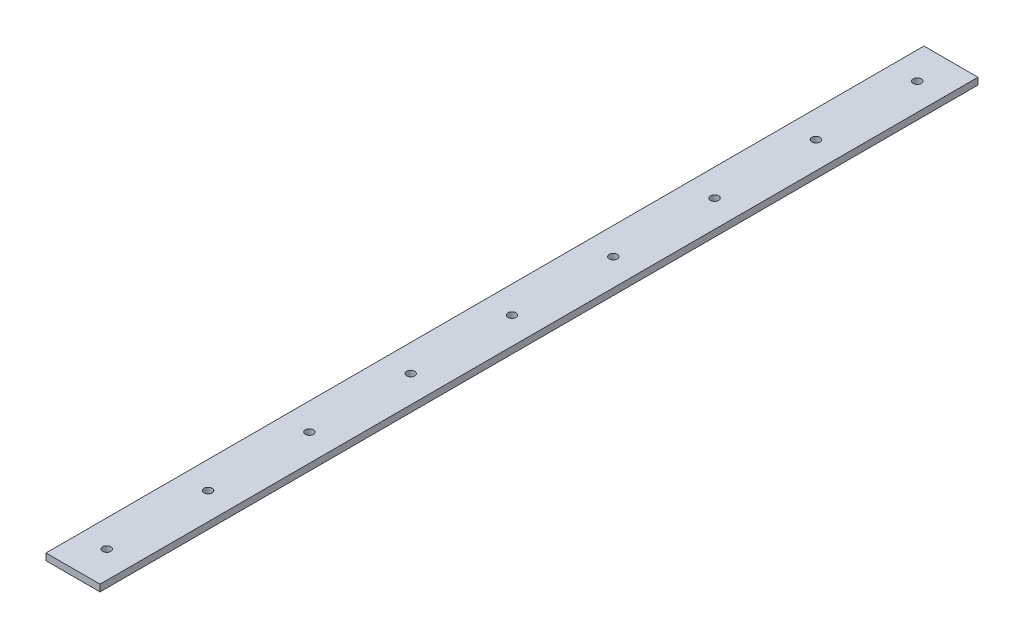
ISO-10303-21;
HEADER;
FILE_DESCRIPTION(('STEP AP214'),'2;1');
FILE_NAME('part.step','',(''),(''),'','','');
FILE_SCHEMA(('AUTOMOTIVE_DESIGN { 1 0 10303 214 1 1 1 1 }'));
ENDSEC;
DATA;
#1=APPLICATION_CONTEXT('core data for automotive mechanical design processes');
#2=APPLICATION_PROTOCOL_DEFINITION('international standard','automotive_design',2000,#1);
#3=PRODUCT_CONTEXT('',#1,'mechanical');
#4=PRODUCT('Part','Part','',(#3));
#5=PRODUCT_RELATED_PRODUCT_CATEGORY('part','',(#4));
#6=PRODUCT_DEFINITION_FORMATION('','',#4);
#7=PRODUCT_DEFINITION_CONTEXT('part definition',#1,'design');
#8=PRODUCT_DEFINITION('design','',#6,#7);
#9=PRODUCT_DEFINITION_SHAPE('','',#8);
#10=(LENGTH_UNIT() NAMED_UNIT(*) SI_UNIT(.MILLI.,.METRE.));
#11=(NAMED_UNIT(*) PLANE_ANGLE_UNIT() SI_UNIT($,.RADIAN.));
#12=(NAMED_UNIT(*) SI_UNIT($,.STERADIAN.) SOLID_ANGLE_UNIT());
#13=UNCERTAINTY_MEASURE_WITH_UNIT(LENGTH_MEASURE(1.E-05),#10,'distance_accuracy_value','');
#14=(GEOMETRIC_REPRESENTATION_CONTEXT(3) GLOBAL_UNCERTAINTY_ASSIGNED_CONTEXT((#13)) GLOBAL_UNIT_ASSIGNED_CONTEXT((#10,
#11,#12)) REPRESENTATION_CONTEXT('',''));
#15=CARTESIAN_POINT('',(0.,0.,0.));
#16=DIRECTION('',(0.,0.,1.));
#17=DIRECTION('',(1.,0.,0.));
#18=AXIS2_PLACEMENT_3D('',#15,#16,#17);
#19=CARTESIAN_POINT('',(20.,5.,325.));
#20=DIRECTION('',(-1.,0.,0.));
#21=DIRECTION('',(0.,0.,1.));
#22=AXIS2_PLACEMENT_3D('',#19,#20,#21);
#23=PLANE('',#22);
#24=DIRECTION('',(0.,0.,-1.));
#25=VECTOR('',#24,1.);
#26=CARTESIAN_POINT('',(20.,0.,325.));
#27=LINE('',#26,#25);
#28=CARTESIAN_POINT('',(20.,0.,325.));
#29=VERTEX_POINT('',#28);
#30=CARTESIAN_POINT('',(20.,0.,-325.));
#31=VERTEX_POINT('',#30);
#32=EDGE_CURVE('E184',#29,#31,#27,.T.);
#33=ORIENTED_EDGE('',*,*,#32,.T.);
#34=DIRECTION('',(0.,-1.,0.));
#35=VECTOR('',#34,1.);
#36=CARTESIAN_POINT('',(20.,5.,-325.));
#37=LINE('',#36,#35);
#38=CARTESIAN_POINT('',(20.,5.,-325.));
#39=VERTEX_POINT('',#38);
#40=EDGE_CURVE('E12',#39,#31,#37,.T.);
#41=ORIENTED_EDGE('',*,*,#40,.F.);
#42=DIRECTION('',(0.,0.,-1.));
#43=VECTOR('',#42,1.);
#44=CARTESIAN_POINT('',(20.,5.,325.));
#45=LINE('',#44,#43);
#46=CARTESIAN_POINT('',(20.,5.,325.));
#47=VERTEX_POINT('',#46);
#48=EDGE_CURVE('E88',#47,#39,#45,.T.);
#49=ORIENTED_EDGE('',*,*,#48,.F.);
#50=DIRECTION('',(0.,-1.,0.));
#51=VECTOR('',#50,1.);
#52=CARTESIAN_POINT('',(20.,5.,325.));
#53=LINE('',#52,#51);
#54=EDGE_CURVE('E97',#47,#29,#53,.T.);
#55=ORIENTED_EDGE('',*,*,#54,.T.);
#56=EDGE_LOOP('',(#33,#41,#49,#55));
#57=FACE_BOUND('',#56,.T.);
#58=ADVANCED_FACE('F35',(#57),#23,.F.);
#59=CARTESIAN_POINT('',(-20.,5.,-325.));
#60=DIRECTION('',(0.,0.,1.));
#61=DIRECTION('',(1.,0.,0.));
#62=AXIS2_PLACEMENT_3D('',#59,#60,#61);
#63=PLANE('',#62);
#64=DIRECTION('',(-1.,0.,0.));
#65=VECTOR('',#64,1.);
#66=CARTESIAN_POINT('',(-20.,0.,-325.));
#67=LINE('',#66,#65);
#68=CARTESIAN_POINT('',(-20.,0.,-325.));
#69=VERTEX_POINT('',#68);
#70=EDGE_CURVE('E92',#31,#69,#67,.T.);
#71=ORIENTED_EDGE('',*,*,#70,.T.);
#72=DIRECTION('',(0.,-1.,0.));
#73=VECTOR('',#72,1.);
#74=CARTESIAN_POINT('',(-20.,5.,-325.));
#75=LINE('',#74,#73);
#76=CARTESIAN_POINT('',(-20.,5.,-325.));
#77=VERTEX_POINT('',#76);
#78=EDGE_CURVE('E44',#77,#69,#75,.T.);
#79=ORIENTED_EDGE('',*,*,#78,.F.);
#80=DIRECTION('',(-1.,0.,0.));
#81=VECTOR('',#80,1.);
#82=CARTESIAN_POINT('',(-20.,5.,-325.));
#83=LINE('',#82,#81);
#84=EDGE_CURVE('E83',#39,#77,#83,.T.);
#85=ORIENTED_EDGE('',*,*,#84,.F.);
#86=ORIENTED_EDGE('',*,*,#40,.T.);
#87=EDGE_LOOP('',(#71,#79,#85,#86));
#88=FACE_BOUND('',#87,.T.);
#89=ADVANCED_FACE('F91',(#88),#63,.F.);
#90=CARTESIAN_POINT('',(-20.,5.,325.));
#91=DIRECTION('',(1.,0.,0.));
#92=DIRECTION('',(0.,0.,-1.));
#93=AXIS2_PLACEMENT_3D('',#90,#91,#92);
#94=PLANE('',#93);
#95=DIRECTION('',(0.,0.,1.));
#96=VECTOR('',#95,1.);
#97=CARTESIAN_POINT('',(-20.,0.,325.));
#98=LINE('',#97,#96);
#99=CARTESIAN_POINT('',(-20.,0.,325.));
#100=VERTEX_POINT('',#99);
#101=EDGE_CURVE('E70',#69,#100,#98,.T.);
#102=ORIENTED_EDGE('',*,*,#101,.T.);
#103=DIRECTION('',(0.,-1.,0.));
#104=VECTOR('',#103,1.);
#105=CARTESIAN_POINT('',(-20.,5.,325.));
#106=LINE('',#105,#104);
#107=CARTESIAN_POINT('',(-20.,5.,325.));
#108=VERTEX_POINT('',#107);
#109=EDGE_CURVE('E93',#108,#100,#106,.T.);
#110=ORIENTED_EDGE('',*,*,#109,.F.);
#111=DIRECTION('',(0.,0.,1.));
#112=VECTOR('',#111,1.);
#113=CARTESIAN_POINT('',(-20.,5.,325.));
#114=LINE('',#113,#112);
#115=EDGE_CURVE('E86',#77,#108,#114,.T.);
#116=ORIENTED_EDGE('',*,*,#115,.F.);
#117=ORIENTED_EDGE('',*,*,#78,.T.);
#118=EDGE_LOOP('',(#102,#110,#116,#117));
#119=FACE_BOUND('',#118,.T.);
#120=ADVANCED_FACE('F95',(#119),#94,.F.);
#121=CARTESIAN_POINT('',(-20.,5.,325.));
#122=DIRECTION('',(0.,0.,-1.));
#123=DIRECTION('',(-1.,0.,0.));
#124=AXIS2_PLACEMENT_3D('',#121,#122,#123);
#125=PLANE('',#124);
#126=DIRECTION('',(1.,0.,0.));
#127=VECTOR('',#126,1.);
#128=CARTESIAN_POINT('',(-20.,0.,325.));
#129=LINE('',#128,#127);
#130=EDGE_CURVE('E76',#100,#29,#129,.T.);
#131=ORIENTED_EDGE('',*,*,#130,.T.);
#132=ORIENTED_EDGE('',*,*,#54,.F.);
#133=DIRECTION('',(1.,0.,0.));
#134=VECTOR('',#133,1.);
#135=CARTESIAN_POINT('',(-20.,5.,325.));
#136=LINE('',#135,#134);
#137=EDGE_CURVE('E53',#108,#47,#136,.T.);
#138=ORIENTED_EDGE('',*,*,#137,.F.);
#139=ORIENTED_EDGE('',*,*,#109,.T.);
#140=EDGE_LOOP('',(#131,#132,#138,#139));
#141=FACE_BOUND('',#140,.T.);
#142=ADVANCED_FACE('F157',(#141),#125,.F.);
#143=CARTESIAN_POINT('',(0.,5.,0.));
#144=DIRECTION('',(0.,-1.,0.));
#145=DIRECTION('',(0.,0.,-1.));
#146=AXIS2_PLACEMENT_3D('',#143,#144,#145);
#147=PLANE('',#146);
#148=CARTESIAN_POINT('',(0.,5.,75.));
#149=DIRECTION('',(0.,1.,0.));
#150=DIRECTION('',(0.,0.,-1.));
#151=AXIS2_PLACEMENT_3D('',#148,#149,#150);
#152=CIRCLE('',#151,3.);
#153=CARTESIAN_POINT('',(0.,5.,72.));
#154=VERTEX_POINT('',#153);
#155=EDGE_CURVE('E115',#154,#154,#152,.T.);
#156=ORIENTED_EDGE('',*,*,#155,.F.);
#157=EDGE_LOOP('',(#156));
#158=FACE_BOUND('',#157,.T.);
#159=CARTESIAN_POINT('',(0.,5.,150.));
#160=DIRECTION('',(0.,1.,0.));
#161=DIRECTION('',(0.,0.,-1.));
#162=AXIS2_PLACEMENT_3D('',#159,#160,#161);
#163=CIRCLE('',#162,3.);
#164=CARTESIAN_POINT('',(0.,5.,147.));
#165=VERTEX_POINT('',#164);
#166=EDGE_CURVE('E119',#165,#165,#163,.T.);
#167=ORIENTED_EDGE('',*,*,#166,.F.);
#168=EDGE_LOOP('',(#167));
#169=FACE_BOUND('',#168,.T.);
#170=CARTESIAN_POINT('',(0.,5.,225.));
#171=DIRECTION('',(0.,1.,0.));
#172=DIRECTION('',(0.,0.,-1.));
#173=AXIS2_PLACEMENT_3D('',#170,#171,#172);
#174=CIRCLE('',#173,3.);
#175=CARTESIAN_POINT('',(0.,5.,222.));
#176=VERTEX_POINT('',#175);
#177=EDGE_CURVE('E128',#176,#176,#174,.T.);
#178=ORIENTED_EDGE('',*,*,#177,.F.);
#179=EDGE_LOOP('',(#178));
#180=FACE_BOUND('',#179,.T.);
#181=CARTESIAN_POINT('',(0.,5.,300.));
#182=DIRECTION('',(0.,1.,0.));
#183=DIRECTION('',(0.,0.,-1.));
#184=AXIS2_PLACEMENT_3D('',#181,#182,#183);
#185=CIRCLE('',#184,3.);
#186=CARTESIAN_POINT('',(0.,5.,297.));
#187=VERTEX_POINT('',#186);
#188=EDGE_CURVE('E131',#187,#187,#185,.T.);
#189=ORIENTED_EDGE('',*,*,#188,.F.);
#190=EDGE_LOOP('',(#189));
#191=FACE_BOUND('',#190,.T.);
#192=CARTESIAN_POINT('',(0.,5.,-300.));
#193=DIRECTION('',(0.,1.,0.));
#194=DIRECTION('',(0.,0.,1.));
#195=AXIS2_PLACEMENT_3D('',#192,#193,#194);
#196=CIRCLE('',#195,3.);
#197=CARTESIAN_POINT('',(0.,5.,-297.));
#198=VERTEX_POINT('',#197);
#199=EDGE_CURVE('E135',#198,#198,#196,.T.);
#200=ORIENTED_EDGE('',*,*,#199,.F.);
#201=EDGE_LOOP('',(#200));
#202=FACE_BOUND('',#201,.T.);
#203=CARTESIAN_POINT('',(0.,5.,-225.));
#204=DIRECTION('',(0.,1.,0.));
#205=DIRECTION('',(0.,0.,1.));
#206=AXIS2_PLACEMENT_3D('',#203,#204,#205);
#207=CIRCLE('',#206,3.);
#208=CARTESIAN_POINT('',(0.,5.,-222.));
#209=VERTEX_POINT('',#208);
#210=EDGE_CURVE('E139',#209,#209,#207,.T.);
#211=ORIENTED_EDGE('',*,*,#210,.F.);
#212=EDGE_LOOP('',(#211));
#213=FACE_BOUND('',#212,.T.);
#214=CARTESIAN_POINT('',(0.,5.,-150.));
#215=DIRECTION('',(0.,1.,0.));
#216=DIRECTION('',(0.,0.,1.));
#217=AXIS2_PLACEMENT_3D('',#214,#215,#216);
#218=CIRCLE('',#217,3.);
#219=CARTESIAN_POINT('',(0.,5.,-147.));
#220=VERTEX_POINT('',#219);
#221=EDGE_CURVE('E145',#220,#220,#218,.T.);
#222=ORIENTED_EDGE('',*,*,#221,.F.);
#223=EDGE_LOOP('',(#222));
#224=FACE_BOUND('',#223,.T.);
#225=CARTESIAN_POINT('',(0.,5.,-75.));
#226=DIRECTION('',(0.,1.,0.));
#227=DIRECTION('',(0.,0.,1.));
#228=AXIS2_PLACEMENT_3D('',#225,#226,#227);
#229=CIRCLE('',#228,3.);
#230=CARTESIAN_POINT('',(0.,5.,-72.));
#231=VERTEX_POINT('',#230);
#232=EDGE_CURVE('E114',#231,#231,#229,.T.);
#233=ORIENTED_EDGE('',*,*,#232,.F.);
#234=EDGE_LOOP('',(#233));
#235=FACE_BOUND('',#234,.T.);
#236=CARTESIAN_POINT('',(0.,5.,0.));
#237=DIRECTION('',(0.,1.,0.));
#238=DIRECTION('',(0.,0.,1.));
#239=AXIS2_PLACEMENT_3D('',#236,#237,#238);
#240=CIRCLE('',#239,3.);
#241=CARTESIAN_POINT('',(0.,5.,3.));
#242=VERTEX_POINT('',#241);
#243=EDGE_CURVE('E109',#242,#242,#240,.T.);
#244=ORIENTED_EDGE('',*,*,#243,.F.);
#245=EDGE_LOOP('',(#244));
#246=FACE_BOUND('',#245,.T.);
#247=ORIENTED_EDGE('',*,*,#48,.T.);
#248=ORIENTED_EDGE('',*,*,#84,.T.);
#249=ORIENTED_EDGE('',*,*,#115,.T.);
#250=ORIENTED_EDGE('',*,*,#137,.T.);
#251=EDGE_LOOP('',(#247,#248,#249,#250));
#252=FACE_BOUND('',#251,.T.);
#253=ADVANCED_FACE('F84',(#158,#169,#180,#191,#202,#213,#224,#235,#246,#252),#147,.F.);
#254=CARTESIAN_POINT('',(0.,0.,0.));
#255=DIRECTION('',(0.,-1.,0.));
#256=DIRECTION('',(0.,0.,-1.));
#257=AXIS2_PLACEMENT_3D('',#254,#255,#256);
#258=PLANE('',#257);
#259=CARTESIAN_POINT('',(0.,0.,75.));
#260=DIRECTION('',(0.,-1.,0.));
#261=DIRECTION('',(0.,0.,-1.));
#262=AXIS2_PLACEMENT_3D('',#259,#260,#261);
#263=CIRCLE('',#262,3.);
#264=CARTESIAN_POINT('',(0.,0.,72.));
#265=VERTEX_POINT('',#264);
#266=EDGE_CURVE('E38',#265,#265,#263,.F.);
#267=ORIENTED_EDGE('',*,*,#266,.T.);
#268=EDGE_LOOP('',(#267));
#269=FACE_BOUND('',#268,.T.);
#270=CARTESIAN_POINT('',(0.,0.,150.));
#271=DIRECTION('',(0.,-1.,0.));
#272=DIRECTION('',(0.,0.,-1.));
#273=AXIS2_PLACEMENT_3D('',#270,#271,#272);
#274=CIRCLE('',#273,3.);
#275=CARTESIAN_POINT('',(0.,0.,147.));
#276=VERTEX_POINT('',#275);
#277=EDGE_CURVE('E188',#276,#276,#274,.F.);
#278=ORIENTED_EDGE('',*,*,#277,.T.);
#279=EDGE_LOOP('',(#278));
#280=FACE_BOUND('',#279,.T.);
#281=CARTESIAN_POINT('',(0.,0.,225.));
#282=DIRECTION('',(0.,-1.,0.));
#283=DIRECTION('',(0.,0.,-1.));
#284=AXIS2_PLACEMENT_3D('',#281,#282,#283);
#285=CIRCLE('',#284,3.);
#286=CARTESIAN_POINT('',(0.,0.,222.));
#287=VERTEX_POINT('',#286);
#288=EDGE_CURVE('E211',#287,#287,#285,.F.);
#289=ORIENTED_EDGE('',*,*,#288,.T.);
#290=EDGE_LOOP('',(#289));
#291=FACE_BOUND('',#290,.T.);
#292=CARTESIAN_POINT('',(0.,0.,300.));
#293=DIRECTION('',(0.,-1.,0.));
#294=DIRECTION('',(0.,0.,-1.));
#295=AXIS2_PLACEMENT_3D('',#292,#293,#294);
#296=CIRCLE('',#295,3.);
#297=CARTESIAN_POINT('',(0.,0.,297.));
#298=VERTEX_POINT('',#297);
#299=EDGE_CURVE('E208',#298,#298,#296,.F.);
#300=ORIENTED_EDGE('',*,*,#299,.T.);
#301=EDGE_LOOP('',(#300));
#302=FACE_BOUND('',#301,.T.);
#303=CARTESIAN_POINT('',(0.,0.,-300.));
#304=DIRECTION('',(0.,-1.,0.));
#305=DIRECTION('',(0.,0.,-1.));
#306=AXIS2_PLACEMENT_3D('',#303,#304,#305);
#307=CIRCLE('',#306,3.);
#308=CARTESIAN_POINT('',(0.,0.,-303.));
#309=VERTEX_POINT('',#308);
#310=EDGE_CURVE('E205',#309,#309,#307,.F.);
#311=ORIENTED_EDGE('',*,*,#310,.T.);
#312=EDGE_LOOP('',(#311));
#313=FACE_BOUND('',#312,.T.);
#314=CARTESIAN_POINT('',(0.,0.,-225.));
#315=DIRECTION('',(0.,-1.,0.));
#316=DIRECTION('',(0.,0.,-1.));
#317=AXIS2_PLACEMENT_3D('',#314,#315,#316);
#318=CIRCLE('',#317,3.);
#319=CARTESIAN_POINT('',(0.,0.,-228.));
#320=VERTEX_POINT('',#319);
#321=EDGE_CURVE('E202',#320,#320,#318,.F.);
#322=ORIENTED_EDGE('',*,*,#321,.T.);
#323=EDGE_LOOP('',(#322));
#324=FACE_BOUND('',#323,.T.);
#325=CARTESIAN_POINT('',(0.,0.,-150.));
#326=DIRECTION('',(0.,-1.,0.));
#327=DIRECTION('',(0.,0.,-1.));
#328=AXIS2_PLACEMENT_3D('',#325,#326,#327);
#329=CIRCLE('',#328,3.);
#330=CARTESIAN_POINT('',(0.,0.,-153.));
#331=VERTEX_POINT('',#330);
#332=EDGE_CURVE('E199',#331,#331,#329,.F.);
#333=ORIENTED_EDGE('',*,*,#332,.T.);
#334=EDGE_LOOP('',(#333));
#335=FACE_BOUND('',#334,.T.);
#336=CARTESIAN_POINT('',(0.,0.,-75.));
#337=DIRECTION('',(0.,-1.,0.));
#338=DIRECTION('',(0.,0.,-1.));
#339=AXIS2_PLACEMENT_3D('',#336,#337,#338);
#340=CIRCLE('',#339,3.);
#341=CARTESIAN_POINT('',(0.,0.,-78.));
#342=VERTEX_POINT('',#341);
#343=EDGE_CURVE('E196',#342,#342,#340,.F.);
#344=ORIENTED_EDGE('',*,*,#343,.T.);
#345=EDGE_LOOP('',(#344));
#346=FACE_BOUND('',#345,.T.);
#347=CARTESIAN_POINT('',(0.,0.,0.));
#348=DIRECTION('',(0.,-1.,0.));
#349=DIRECTION('',(0.,0.,-1.));
#350=AXIS2_PLACEMENT_3D('',#347,#348,#349);
#351=CIRCLE('',#350,3.);
#352=CARTESIAN_POINT('',(0.,0.,-3.));
#353=VERTEX_POINT('',#352);
#354=EDGE_CURVE('E113',#353,#353,#351,.F.);
#355=ORIENTED_EDGE('',*,*,#354,.T.);
#356=EDGE_LOOP('',(#355));
#357=FACE_BOUND('',#356,.T.);
#358=ORIENTED_EDGE('',*,*,#32,.F.);
#359=ORIENTED_EDGE('',*,*,#130,.F.);
#360=ORIENTED_EDGE('',*,*,#101,.F.);
#361=ORIENTED_EDGE('',*,*,#70,.F.);
#362=EDGE_LOOP('',(#358,#359,#360,#361));
#363=FACE_BOUND('',#362,.T.);
#364=ADVANCED_FACE('F156',(#269,#280,#291,#302,#313,#324,#335,#346,#357,#363),#258,.T.);
#365=CARTESIAN_POINT('',(0.,5.,0.));
#366=DIRECTION('',(0.,-1.,0.));
#367=DIRECTION('',(0.,0.,-1.));
#368=AXIS2_PLACEMENT_3D('',#365,#366,#367);
#369=CYLINDRICAL_SURFACE('',#368,3.);
#370=ORIENTED_EDGE('',*,*,#354,.F.);
#371=EDGE_LOOP('',(#370));
#372=FACE_BOUND('',#371,.T.);
#373=ORIENTED_EDGE('',*,*,#243,.T.);
#374=EDGE_LOOP('',(#373));
#375=FACE_BOUND('',#374,.T.);
#376=ADVANCED_FACE('F162',(#372,#375),#369,.F.);
#377=CARTESIAN_POINT('',(0.,5.,-75.));
#378=DIRECTION('',(0.,-1.,0.));
#379=DIRECTION('',(0.,0.,-1.));
#380=AXIS2_PLACEMENT_3D('',#377,#378,#379);
#381=CYLINDRICAL_SURFACE('',#380,3.);
#382=ORIENTED_EDGE('',*,*,#343,.F.);
#383=EDGE_LOOP('',(#382));
#384=FACE_BOUND('',#383,.T.);
#385=ORIENTED_EDGE('',*,*,#232,.T.);
#386=EDGE_LOOP('',(#385));
#387=FACE_BOUND('',#386,.T.);
#388=ADVANCED_FACE('F152',(#384,#387),#381,.F.);
#389=CARTESIAN_POINT('',(0.,5.,-150.));
#390=DIRECTION('',(0.,-1.,0.));
#391=DIRECTION('',(0.,0.,-1.));
#392=AXIS2_PLACEMENT_3D('',#389,#390,#391);
#393=CYLINDRICAL_SURFACE('',#392,3.);
#394=ORIENTED_EDGE('',*,*,#332,.F.);
#395=EDGE_LOOP('',(#394));
#396=FACE_BOUND('',#395,.T.);
#397=ORIENTED_EDGE('',*,*,#221,.T.);
#398=EDGE_LOOP('',(#397));
#399=FACE_BOUND('',#398,.T.);
#400=ADVANCED_FACE('F170',(#396,#399),#393,.F.);
#401=CARTESIAN_POINT('',(0.,5.,-225.));
#402=DIRECTION('',(0.,-1.,0.));
#403=DIRECTION('',(0.,0.,-1.));
#404=AXIS2_PLACEMENT_3D('',#401,#402,#403);
#405=CYLINDRICAL_SURFACE('',#404,3.);
#406=ORIENTED_EDGE('',*,*,#321,.F.);
#407=EDGE_LOOP('',(#406));
#408=FACE_BOUND('',#407,.T.);
#409=ORIENTED_EDGE('',*,*,#210,.T.);
#410=EDGE_LOOP('',(#409));
#411=FACE_BOUND('',#410,.T.);
#412=ADVANCED_FACE('F240',(#408,#411),#405,.F.);
#413=CARTESIAN_POINT('',(0.,5.,-300.));
#414=DIRECTION('',(0.,-1.,0.));
#415=DIRECTION('',(0.,0.,-1.));
#416=AXIS2_PLACEMENT_3D('',#413,#414,#415);
#417=CYLINDRICAL_SURFACE('',#416,3.);
#418=ORIENTED_EDGE('',*,*,#310,.F.);
#419=EDGE_LOOP('',(#418));
#420=FACE_BOUND('',#419,.T.);
#421=ORIENTED_EDGE('',*,*,#199,.T.);
#422=EDGE_LOOP('',(#421));
#423=FACE_BOUND('',#422,.T.);
#424=ADVANCED_FACE('F246',(#420,#423),#417,.F.);
#425=CARTESIAN_POINT('',(0.,5.,300.));
#426=DIRECTION('',(0.,-1.,0.));
#427=DIRECTION('',(0.,0.,-1.));
#428=AXIS2_PLACEMENT_3D('',#425,#426,#427);
#429=CYLINDRICAL_SURFACE('',#428,3.);
#430=ORIENTED_EDGE('',*,*,#299,.F.);
#431=EDGE_LOOP('',(#430));
#432=FACE_BOUND('',#431,.T.);
#433=ORIENTED_EDGE('',*,*,#188,.T.);
#434=EDGE_LOOP('',(#433));
#435=FACE_BOUND('',#434,.T.);
#436=ADVANCED_FACE('F253',(#432,#435),#429,.F.);
#437=CARTESIAN_POINT('',(0.,5.,225.));
#438=DIRECTION('',(0.,-1.,0.));
#439=DIRECTION('',(0.,0.,-1.));
#440=AXIS2_PLACEMENT_3D('',#437,#438,#439);
#441=CYLINDRICAL_SURFACE('',#440,3.);
#442=ORIENTED_EDGE('',*,*,#288,.F.);
#443=EDGE_LOOP('',(#442));
#444=FACE_BOUND('',#443,.T.);
#445=ORIENTED_EDGE('',*,*,#177,.T.);
#446=EDGE_LOOP('',(#445));
#447=FACE_BOUND('',#446,.T.);
#448=ADVANCED_FACE('F222',(#444,#447),#441,.F.);
#449=CARTESIAN_POINT('',(0.,5.,150.));
#450=DIRECTION('',(0.,-1.,0.));
#451=DIRECTION('',(0.,0.,-1.));
#452=AXIS2_PLACEMENT_3D('',#449,#450,#451);
#453=CYLINDRICAL_SURFACE('',#452,3.);
#454=ORIENTED_EDGE('',*,*,#277,.F.);
#455=EDGE_LOOP('',(#454));
#456=FACE_BOUND('',#455,.T.);
#457=ORIENTED_EDGE('',*,*,#166,.T.);
#458=EDGE_LOOP('',(#457));
#459=FACE_BOUND('',#458,.T.);
#460=ADVANCED_FACE('F218',(#456,#459),#453,.F.);
#461=CARTESIAN_POINT('',(0.,5.,75.));
#462=DIRECTION('',(0.,-1.,0.));
#463=DIRECTION('',(0.,0.,-1.));
#464=AXIS2_PLACEMENT_3D('',#461,#462,#463);
#465=CYLINDRICAL_SURFACE('',#464,3.);
#466=ORIENTED_EDGE('',*,*,#266,.F.);
#467=EDGE_LOOP('',(#466));
#468=FACE_BOUND('',#467,.T.);
#469=ORIENTED_EDGE('',*,*,#155,.T.);
#470=EDGE_LOOP('',(#469));
#471=FACE_BOUND('',#470,.T.);
#472=ADVANCED_FACE('F221',(#468,#471),#465,.F.);
#473=CLOSED_SHELL('',(#58,#89,#120,#142,#253,#364,#376,#388,#400,#412,#424,#436,#448,#460,#472));
#474=MANIFOLD_SOLID_BREP('B2',#473);
#475=ADVANCED_BREP_SHAPE_REPRESENTATION('',(#18,#474),#14);
#476=SHAPE_DEFINITION_REPRESENTATION(#9,#475);
ENDSEC;
END-ISO-10303-21;
